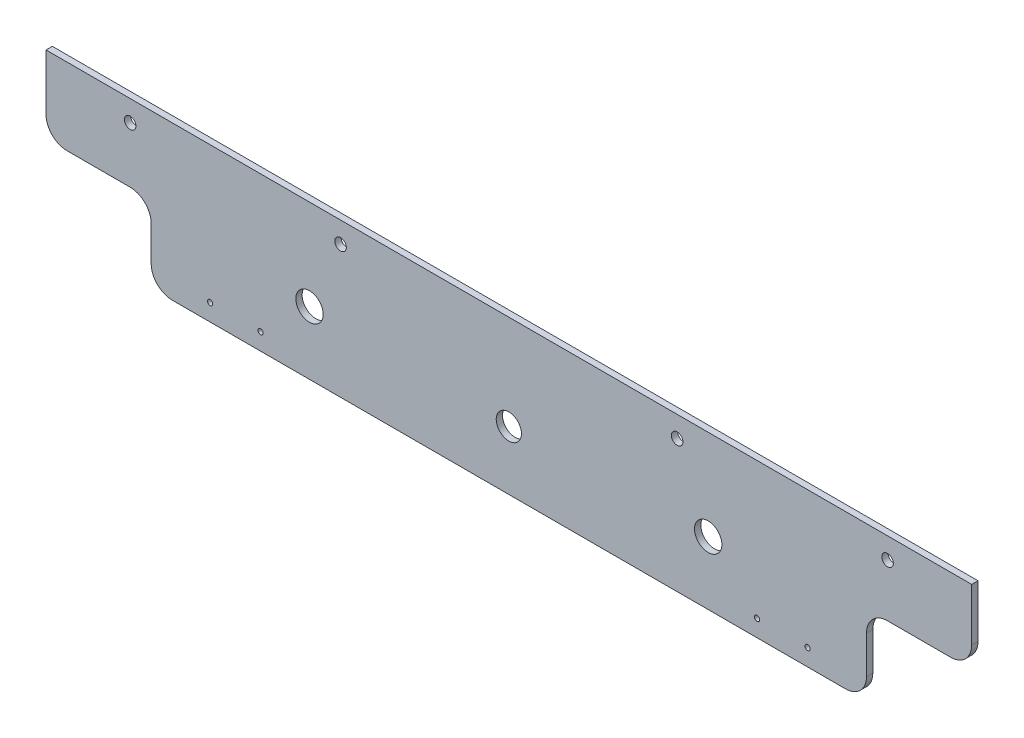
ISO-10303-21;
HEADER;
FILE_DESCRIPTION(('STEP AP214'),'2;1');
FILE_NAME('part.step','',(''),(''),'','','');
FILE_SCHEMA(('AUTOMOTIVE_DESIGN { 1 0 10303 214 1 1 1 1 }'));
ENDSEC;
DATA;
#1=APPLICATION_CONTEXT('core data for automotive mechanical design processes');
#2=APPLICATION_PROTOCOL_DEFINITION('international standard','automotive_design',2000,#1);
#3=PRODUCT_CONTEXT('',#1,'mechanical');
#4=PRODUCT('Part','Part','',(#3));
#5=PRODUCT_RELATED_PRODUCT_CATEGORY('part','',(#4));
#6=PRODUCT_DEFINITION_FORMATION('','',#4);
#7=PRODUCT_DEFINITION_CONTEXT('part definition',#1,'design');
#8=PRODUCT_DEFINITION('design','',#6,#7);
#9=PRODUCT_DEFINITION_SHAPE('','',#8);
#10=(LENGTH_UNIT() NAMED_UNIT(*) SI_UNIT(.MILLI.,.METRE.));
#11=(NAMED_UNIT(*) PLANE_ANGLE_UNIT() SI_UNIT($,.RADIAN.));
#12=(NAMED_UNIT(*) SI_UNIT($,.STERADIAN.) SOLID_ANGLE_UNIT());
#13=UNCERTAINTY_MEASURE_WITH_UNIT(LENGTH_MEASURE(1.E-05),#10,'distance_accuracy_value','');
#14=(GEOMETRIC_REPRESENTATION_CONTEXT(3) GLOBAL_UNCERTAINTY_ASSIGNED_CONTEXT((#13)) GLOBAL_UNIT_ASSIGNED_CONTEXT((#10,
#11,#12)) REPRESENTATION_CONTEXT('',''));
#15=CARTESIAN_POINT('',(0.,0.,0.));
#16=DIRECTION('',(0.,0.,1.));
#17=DIRECTION('',(1.,0.,0.));
#18=AXIS2_PLACEMENT_3D('',#15,#16,#17);
#19=CARTESIAN_POINT('',(209.999999998912,20.0000000000026,3.));
#20=DIRECTION('',(0.,0.,1.));
#21=DIRECTION('',(1.,0.,0.));
#22=AXIS2_PLACEMENT_3D('',#19,#20,#21);
#23=PLANE('',#22);
#24=CARTESIAN_POINT('',(179.999999998912,35.0000000000026,3.));
#25=DIRECTION('',(0.,0.,1.));
#26=DIRECTION('',(1.,0.,0.));
#27=AXIS2_PLACEMENT_3D('',#24,#25,#26);
#28=CIRCLE('',#27,2.75);
#29=CARTESIAN_POINT('',(182.749999998912,35.0000000000026,3.));
#30=VERTEX_POINT('',#29);
#31=EDGE_CURVE('E327',#30,#30,#28,.T.);
#32=ORIENTED_EDGE('',*,*,#31,.F.);
#33=EDGE_LOOP('',(#32));
#34=FACE_BOUND('',#33,.T.);
#35=CARTESIAN_POINT('',(79.9999999989121,35.0000000000026,3.));
#36=DIRECTION('',(0.,0.,1.));
#37=DIRECTION('',(1.,0.,0.));
#38=AXIS2_PLACEMENT_3D('',#35,#36,#37);
#39=CIRCLE('',#38,2.75);
#40=CARTESIAN_POINT('',(82.7499999989121,35.0000000000026,3.));
#41=VERTEX_POINT('',#40);
#42=EDGE_CURVE('E333',#41,#41,#39,.T.);
#43=ORIENTED_EDGE('',*,*,#42,.F.);
#44=EDGE_LOOP('',(#43));
#45=FACE_BOUND('',#44,.T.);
#46=CARTESIAN_POINT('',(-79.9999999999742,35.0000000000026,3.));
#47=DIRECTION('',(0.,0.,1.));
#48=DIRECTION('',(1.,0.,0.));
#49=AXIS2_PLACEMENT_3D('',#46,#47,#48);
#50=CIRCLE('',#49,2.75);
#51=CARTESIAN_POINT('',(-77.2499999999742,35.0000000000026,3.));
#52=VERTEX_POINT('',#51);
#53=EDGE_CURVE('E341',#52,#52,#50,.T.);
#54=ORIENTED_EDGE('',*,*,#53,.F.);
#55=EDGE_LOOP('',(#54));
#56=FACE_BOUND('',#55,.T.);
#57=CARTESIAN_POINT('',(-179.999999999974,35.0000000000026,3.));
#58=DIRECTION('',(0.,0.,1.));
#59=DIRECTION('',(1.,0.,0.));
#60=AXIS2_PLACEMENT_3D('',#57,#58,#59);
#61=CIRCLE('',#60,2.75);
#62=CARTESIAN_POINT('',(-177.249999999974,35.0000000000026,3.));
#63=VERTEX_POINT('',#62);
#64=EDGE_CURVE('E347',#63,#63,#61,.T.);
#65=ORIENTED_EDGE('',*,*,#64,.F.);
#66=EDGE_LOOP('',(#65));
#67=FACE_BOUND('',#66,.T.);
#68=CARTESIAN_POINT('',(-141.999999999439,-20.,3.));
#69=DIRECTION('',(0.,0.,1.));
#70=DIRECTION('',(1.,0.,0.));
#71=AXIS2_PLACEMENT_3D('',#68,#69,#70);
#72=CIRCLE('',#71,1.25);
#73=CARTESIAN_POINT('',(-140.749999999439,-20.,3.));
#74=VERTEX_POINT('',#73);
#75=EDGE_CURVE('E356',#74,#74,#72,.T.);
#76=ORIENTED_EDGE('',*,*,#75,.F.);
#77=EDGE_LOOP('',(#76));
#78=FACE_BOUND('',#77,.T.);
#79=CARTESIAN_POINT('',(94.7499999994415,2.00000000000815,3.));
#80=DIRECTION('',(0.,0.,1.));
#81=DIRECTION('',(1.,0.,0.));
#82=AXIS2_PLACEMENT_3D('',#79,#80,#81);
#83=CIRCLE('',#82,6.5);
#84=CARTESIAN_POINT('',(101.249999999442,2.00000000000815,3.));
#85=VERTEX_POINT('',#84);
#86=EDGE_CURVE('E368',#85,#85,#83,.T.);
#87=ORIENTED_EDGE('',*,*,#86,.F.);
#88=EDGE_LOOP('',(#87));
#89=FACE_BOUND('',#88,.T.);
#90=CARTESIAN_POINT('',(141.999999998377,-20.,3.));
#91=DIRECTION('',(0.,0.,1.));
#92=DIRECTION('',(-1.,0.,0.));
#93=AXIS2_PLACEMENT_3D('',#90,#91,#92);
#94=CIRCLE('',#93,1.25);
#95=CARTESIAN_POINT('',(140.749999998377,-20.,3.));
#96=VERTEX_POINT('',#95);
#97=EDGE_CURVE('E380',#96,#96,#94,.T.);
#98=ORIENTED_EDGE('',*,*,#97,.F.);
#99=EDGE_LOOP('',(#98));
#100=FACE_BOUND('',#99,.T.);
#101=DIRECTION('',(0.,1.,0.));
#102=VECTOR('',#101,1.);
#103=CARTESIAN_POINT('',(219.999999998912,45.0000000000026,3.));
#104=LINE('',#103,#102);
#105=CARTESIAN_POINT('',(219.999999998912,20.0000000000026,3.));
#106=VERTEX_POINT('',#105);
#107=CARTESIAN_POINT('',(219.999999998912,45.0000000000026,3.));
#108=VERTEX_POINT('',#107);
#109=EDGE_CURVE('E177',#106,#108,#104,.T.);
#110=ORIENTED_EDGE('',*,*,#109,.T.);
#111=DIRECTION('',(-1.,0.,0.));
#112=VECTOR('',#111,1.);
#113=CARTESIAN_POINT('',(219.999999998912,45.0000000000026,3.));
#114=LINE('',#113,#112);
#115=CARTESIAN_POINT('',(-219.999999999974,45.0000000000025,3.));
#116=VERTEX_POINT('',#115);
#117=EDGE_CURVE('E95',#108,#116,#114,.T.);
#118=ORIENTED_EDGE('',*,*,#117,.T.);
#119=DIRECTION('',(0.,-1.,0.));
#120=VECTOR('',#119,1.);
#121=CARTESIAN_POINT('',(-219.999999999974,45.0000000000025,3.));
#122=LINE('',#121,#120);
#123=CARTESIAN_POINT('',(-219.999999999975,18.5000000000025,3.));
#124=VERTEX_POINT('',#123);
#125=EDGE_CURVE('E210',#116,#124,#122,.T.);
#126=ORIENTED_EDGE('',*,*,#125,.T.);
#127=CARTESIAN_POINT('',(-209.999999999974,18.5000000000025,3.));
#128=DIRECTION('',(0.,0.,1.));
#129=DIRECTION('',(-1.,0.,0.));
#130=AXIS2_PLACEMENT_3D('',#127,#128,#129);
#131=CIRCLE('',#130,10.);
#132=CARTESIAN_POINT('',(-209.999999999974,8.50000000000245,3.));
#133=VERTEX_POINT('',#132);
#134=EDGE_CURVE('E229',#124,#133,#131,.T.);
#135=ORIENTED_EDGE('',*,*,#134,.T.);
#136=DIRECTION('',(1.,0.,0.));
#137=VECTOR('',#136,1.);
#138=CARTESIAN_POINT('',(-209.999999999974,8.50000000000246,3.));
#139=LINE('',#138,#137);
#140=CARTESIAN_POINT('',(-179.999999999974,8.50000000000248,3.));
#141=VERTEX_POINT('',#140);
#142=EDGE_CURVE('E226',#133,#141,#139,.T.);
#143=ORIENTED_EDGE('',*,*,#142,.T.);
#144=CARTESIAN_POINT('',(-179.999999999974,-1.49999999999757,3.));
#145=DIRECTION('',(0.,0.,-1.));
#146=DIRECTION('',(-1.,0.,0.));
#147=AXIS2_PLACEMENT_3D('',#144,#145,#146);
#148=CIRCLE('',#147,10.);
#149=CARTESIAN_POINT('',(-169.999999999974,-1.49999999999756,3.));
#150=VERTEX_POINT('',#149);
#151=EDGE_CURVE('E228',#141,#150,#148,.T.);
#152=ORIENTED_EDGE('',*,*,#151,.T.);
#153=DIRECTION('',(0.,-1.,0.));
#154=VECTOR('',#153,1.);
#155=CARTESIAN_POINT('',(-169.999999999974,-1.49999999999756,3.));
#156=LINE('',#155,#154);
#157=CARTESIAN_POINT('',(-169.999999999974,-17.9999999999975,3.));
#158=VERTEX_POINT('',#157);
#159=EDGE_CURVE('E231',#150,#158,#156,.T.);
#160=ORIENTED_EDGE('',*,*,#159,.T.);
#161=CARTESIAN_POINT('',(-159.999999999974,-17.9999999999975,3.));
#162=DIRECTION('',(0.,0.,1.));
#163=DIRECTION('',(1.,0.,0.));
#164=AXIS2_PLACEMENT_3D('',#161,#162,#163);
#165=CIRCLE('',#164,10.);
#166=CARTESIAN_POINT('',(-159.999999999974,-27.9999999999975,3.));
#167=VERTEX_POINT('',#166);
#168=EDGE_CURVE('E237',#158,#167,#165,.T.);
#169=ORIENTED_EDGE('',*,*,#168,.T.);
#170=DIRECTION('',(1.,0.,0.));
#171=VECTOR('',#170,1.);
#172=CARTESIAN_POINT('',(159.999999998912,-27.9999999999974,3.));
#173=LINE('',#172,#171);
#174=CARTESIAN_POINT('',(159.999999998912,-27.9999999999974,3.));
#175=VERTEX_POINT('',#174);
#176=EDGE_CURVE('E239',#167,#175,#173,.T.);
#177=ORIENTED_EDGE('',*,*,#176,.T.);
#178=CARTESIAN_POINT('',(159.999999998912,-17.9999999999973,3.));
#179=DIRECTION('',(0.,0.,1.));
#180=DIRECTION('',(-1.,0.,0.));
#181=AXIS2_PLACEMENT_3D('',#178,#179,#180);
#182=CIRCLE('',#181,10.);
#183=CARTESIAN_POINT('',(169.999999998912,-17.9999999999973,3.));
#184=VERTEX_POINT('',#183);
#185=EDGE_CURVE('E241',#175,#184,#182,.T.);
#186=ORIENTED_EDGE('',*,*,#185,.T.);
#187=DIRECTION('',(0.,1.,0.));
#188=VECTOR('',#187,1.);
#189=CARTESIAN_POINT('',(169.999999998912,2.55481399924485E-12,3.));
#190=LINE('',#189,#188);
#191=CARTESIAN_POINT('',(169.999999998912,2.55481399924485E-12,3.));
#192=VERTEX_POINT('',#191);
#193=EDGE_CURVE('E132',#184,#192,#190,.T.);
#194=ORIENTED_EDGE('',*,*,#193,.T.);
#195=CARTESIAN_POINT('',(179.999999998912,2.55611504185183E-12,3.));
#196=DIRECTION('',(0.,0.,-1.));
#197=DIRECTION('',(-1.,0.,0.));
#198=AXIS2_PLACEMENT_3D('',#195,#196,#197);
#199=CIRCLE('',#198,10.);
#200=CARTESIAN_POINT('',(179.999999998912,10.0000000000026,3.));
#201=VERTEX_POINT('',#200);
#202=EDGE_CURVE('E126',#192,#201,#199,.T.);
#203=ORIENTED_EDGE('',*,*,#202,.T.);
#204=DIRECTION('',(1.,0.,0.));
#205=VECTOR('',#204,1.);
#206=CARTESIAN_POINT('',(209.999999998912,10.0000000000026,3.));
#207=LINE('',#206,#205);
#208=CARTESIAN_POINT('',(209.999999998912,10.0000000000026,3.));
#209=VERTEX_POINT('',#208);
#210=EDGE_CURVE('E130',#201,#209,#207,.T.);
#211=ORIENTED_EDGE('',*,*,#210,.T.);
#212=CARTESIAN_POINT('',(209.999999998912,20.0000000000026,3.));
#213=DIRECTION('',(0.,0.,1.));
#214=DIRECTION('',(1.,0.,0.));
#215=AXIS2_PLACEMENT_3D('',#212,#213,#214);
#216=CIRCLE('',#215,10.);
#217=EDGE_CURVE('E34',#209,#106,#216,.T.);
#218=ORIENTED_EDGE('',*,*,#217,.T.);
#219=EDGE_LOOP('',(#110,#118,#126,#135,#143,#152,#160,#169,#177,#186,#194,#203,#211,#218));
#220=FACE_BOUND('',#219,.T.);
#221=CARTESIAN_POINT('',(117.999999998377,-20.0000000000002,3.));
#222=DIRECTION('',(0.,0.,1.));
#223=DIRECTION('',(-1.,0.,0.));
#224=AXIS2_PLACEMENT_3D('',#221,#222,#223);
#225=CIRCLE('',#224,1.25);
#226=CARTESIAN_POINT('',(116.749999998377,-20.0000000000002,3.));
#227=VERTEX_POINT('',#226);
#228=EDGE_CURVE('E154',#227,#227,#225,.T.);
#229=ORIENTED_EDGE('',*,*,#228,.F.);
#230=EDGE_LOOP('',(#229));
#231=FACE_BOUND('',#230,.T.);
#232=CARTESIAN_POINT('',(-94.7500000005567,2.00000000000073,3.));
#233=DIRECTION('',(0.,0.,1.));
#234=DIRECTION('',(1.,0.,0.));
#235=AXIS2_PLACEMENT_3D('',#232,#233,#234);
#236=CIRCLE('',#235,6.5);
#237=CARTESIAN_POINT('',(-88.2500000005567,2.00000000000073,3.));
#238=VERTEX_POINT('',#237);
#239=EDGE_CURVE('E374',#238,#238,#236,.T.);
#240=ORIENTED_EDGE('',*,*,#239,.F.);
#241=EDGE_LOOP('',(#240));
#242=FACE_BOUND('',#241,.T.);
#243=CARTESIAN_POINT('',(0.,0.,3.));
#244=DIRECTION('',(0.,0.,1.));
#245=DIRECTION('',(1.,0.,0.));
#246=AXIS2_PLACEMENT_3D('',#243,#244,#245);
#247=CIRCLE('',#246,6.);
#248=CARTESIAN_POINT('',(6.,0.,3.));
#249=VERTEX_POINT('',#248);
#250=EDGE_CURVE('E362',#249,#249,#247,.T.);
#251=ORIENTED_EDGE('',*,*,#250,.F.);
#252=EDGE_LOOP('',(#251));
#253=FACE_BOUND('',#252,.T.);
#254=CARTESIAN_POINT('',(-117.999999999439,-20.0000000000002,3.));
#255=DIRECTION('',(0.,0.,1.));
#256=DIRECTION('',(1.,0.,0.));
#257=AXIS2_PLACEMENT_3D('',#254,#255,#256);
#258=CIRCLE('',#257,1.25);
#259=CARTESIAN_POINT('',(-116.749999999439,-20.0000000000002,3.));
#260=VERTEX_POINT('',#259);
#261=EDGE_CURVE('E350',#260,#260,#258,.T.);
#262=ORIENTED_EDGE('',*,*,#261,.F.);
#263=EDGE_LOOP('',(#262));
#264=FACE_BOUND('',#263,.T.);
#265=ADVANCED_FACE('F17',(#34,#45,#56,#67,#78,#89,#100,#220,#231,#242,#253,#264),#23,.T.);
#266=CARTESIAN_POINT('',(209.999999998912,20.0000000000026,0.));
#267=DIRECTION('',(0.,0.,1.));
#268=DIRECTION('',(1.,0.,0.));
#269=AXIS2_PLACEMENT_3D('',#266,#267,#268);
#270=PLANE('',#269);
#271=CARTESIAN_POINT('',(179.999999998912,35.0000000000026,0.));
#272=DIRECTION('',(0.,0.,1.));
#273=DIRECTION('',(1.,0.,0.));
#274=AXIS2_PLACEMENT_3D('',#271,#272,#273);
#275=CIRCLE('',#274,2.75);
#276=CARTESIAN_POINT('',(182.749999998912,35.0000000000026,0.));
#277=VERTEX_POINT('',#276);
#278=EDGE_CURVE('E325',#277,#277,#275,.T.);
#279=ORIENTED_EDGE('',*,*,#278,.T.);
#280=EDGE_LOOP('',(#279));
#281=FACE_BOUND('',#280,.T.);
#282=CARTESIAN_POINT('',(79.9999999989121,35.0000000000026,0.));
#283=DIRECTION('',(0.,0.,1.));
#284=DIRECTION('',(1.,0.,0.));
#285=AXIS2_PLACEMENT_3D('',#282,#283,#284);
#286=CIRCLE('',#285,2.75);
#287=CARTESIAN_POINT('',(82.7499999989121,35.0000000000026,0.));
#288=VERTEX_POINT('',#287);
#289=EDGE_CURVE('E328',#288,#288,#286,.T.);
#290=ORIENTED_EDGE('',*,*,#289,.T.);
#291=EDGE_LOOP('',(#290));
#292=FACE_BOUND('',#291,.T.);
#293=CARTESIAN_POINT('',(-79.9999999999742,35.0000000000026,0.));
#294=DIRECTION('',(0.,0.,1.));
#295=DIRECTION('',(1.,0.,0.));
#296=AXIS2_PLACEMENT_3D('',#293,#294,#295);
#297=CIRCLE('',#296,2.75);
#298=CARTESIAN_POINT('',(-77.2499999999742,35.0000000000026,0.));
#299=VERTEX_POINT('',#298);
#300=EDGE_CURVE('E338',#299,#299,#297,.T.);
#301=ORIENTED_EDGE('',*,*,#300,.T.);
#302=EDGE_LOOP('',(#301));
#303=FACE_BOUND('',#302,.T.);
#304=CARTESIAN_POINT('',(-179.999999999974,35.0000000000026,0.));
#305=DIRECTION('',(0.,0.,1.));
#306=DIRECTION('',(1.,0.,0.));
#307=AXIS2_PLACEMENT_3D('',#304,#305,#306);
#308=CIRCLE('',#307,2.75);
#309=CARTESIAN_POINT('',(-177.249999999974,35.0000000000026,0.));
#310=VERTEX_POINT('',#309);
#311=EDGE_CURVE('E344',#310,#310,#308,.T.);
#312=ORIENTED_EDGE('',*,*,#311,.T.);
#313=EDGE_LOOP('',(#312));
#314=FACE_BOUND('',#313,.T.);
#315=DIRECTION('',(0.,1.,0.));
#316=VECTOR('',#315,1.);
#317=CARTESIAN_POINT('',(219.999999998912,45.0000000000026,0.));
#318=LINE('',#317,#316);
#319=CARTESIAN_POINT('',(219.999999998912,20.0000000000026,0.));
#320=VERTEX_POINT('',#319);
#321=CARTESIAN_POINT('',(219.999999998912,45.0000000000026,0.));
#322=VERTEX_POINT('',#321);
#323=EDGE_CURVE('E150',#320,#322,#318,.T.);
#324=ORIENTED_EDGE('',*,*,#323,.F.);
#325=CARTESIAN_POINT('',(209.999999998912,20.0000000000026,0.));
#326=DIRECTION('',(0.,0.,1.));
#327=DIRECTION('',(1.,0.,0.));
#328=AXIS2_PLACEMENT_3D('',#325,#326,#327);
#329=CIRCLE('',#328,10.);
#330=CARTESIAN_POINT('',(209.999999998912,10.0000000000026,0.));
#331=VERTEX_POINT('',#330);
#332=EDGE_CURVE('E87',#331,#320,#329,.T.);
#333=ORIENTED_EDGE('',*,*,#332,.F.);
#334=DIRECTION('',(1.,0.,0.));
#335=VECTOR('',#334,1.);
#336=CARTESIAN_POINT('',(209.999999998912,10.0000000000026,0.));
#337=LINE('',#336,#335);
#338=CARTESIAN_POINT('',(179.999999998912,10.0000000000026,0.));
#339=VERTEX_POINT('',#338);
#340=EDGE_CURVE('E81',#339,#331,#337,.T.);
#341=ORIENTED_EDGE('',*,*,#340,.F.);
#342=CARTESIAN_POINT('',(179.999999998912,2.55611504185183E-12,0.));
#343=DIRECTION('',(0.,0.,-1.));
#344=DIRECTION('',(-1.,0.,0.));
#345=AXIS2_PLACEMENT_3D('',#342,#343,#344);
#346=CIRCLE('',#345,10.);
#347=CARTESIAN_POINT('',(169.999999998912,2.55481399924485E-12,0.));
#348=VERTEX_POINT('',#347);
#349=EDGE_CURVE('E140',#348,#339,#346,.T.);
#350=ORIENTED_EDGE('',*,*,#349,.F.);
#351=DIRECTION('',(0.,1.,0.));
#352=VECTOR('',#351,1.);
#353=CARTESIAN_POINT('',(169.999999998912,2.55481399924485E-12,0.));
#354=LINE('',#353,#352);
#355=CARTESIAN_POINT('',(169.999999998912,-17.9999999999973,0.));
#356=VERTEX_POINT('',#355);
#357=EDGE_CURVE('E172',#356,#348,#354,.T.);
#358=ORIENTED_EDGE('',*,*,#357,.F.);
#359=CARTESIAN_POINT('',(159.999999998912,-17.9999999999973,0.));
#360=DIRECTION('',(0.,0.,1.));
#361=DIRECTION('',(-1.,0.,0.));
#362=AXIS2_PLACEMENT_3D('',#359,#360,#361);
#363=CIRCLE('',#362,10.);
#364=CARTESIAN_POINT('',(159.999999998912,-27.9999999999974,0.));
#365=VERTEX_POINT('',#364);
#366=EDGE_CURVE('E170',#365,#356,#363,.T.);
#367=ORIENTED_EDGE('',*,*,#366,.F.);
#368=DIRECTION('',(1.,0.,0.));
#369=VECTOR('',#368,1.);
#370=CARTESIAN_POINT('',(159.999999998912,-27.9999999999974,0.));
#371=LINE('',#370,#369);
#372=CARTESIAN_POINT('',(-159.999999999974,-27.9999999999975,0.));
#373=VERTEX_POINT('',#372);
#374=EDGE_CURVE('E168',#373,#365,#371,.T.);
#375=ORIENTED_EDGE('',*,*,#374,.F.);
#376=CARTESIAN_POINT('',(-159.999999999974,-17.9999999999975,0.));
#377=DIRECTION('',(0.,0.,1.));
#378=DIRECTION('',(1.,0.,0.));
#379=AXIS2_PLACEMENT_3D('',#376,#377,#378);
#380=CIRCLE('',#379,10.);
#381=CARTESIAN_POINT('',(-169.999999999974,-17.9999999999975,0.));
#382=VERTEX_POINT('',#381);
#383=EDGE_CURVE('E166',#382,#373,#380,.T.);
#384=ORIENTED_EDGE('',*,*,#383,.F.);
#385=DIRECTION('',(0.,-1.,0.));
#386=VECTOR('',#385,1.);
#387=CARTESIAN_POINT('',(-169.999999999974,-1.49999999999756,0.));
#388=LINE('',#387,#386);
#389=CARTESIAN_POINT('',(-169.999999999974,-1.49999999999756,0.));
#390=VERTEX_POINT('',#389);
#391=EDGE_CURVE('E164',#390,#382,#388,.T.);
#392=ORIENTED_EDGE('',*,*,#391,.F.);
#393=CARTESIAN_POINT('',(-179.999999999974,-1.49999999999757,0.));
#394=DIRECTION('',(0.,0.,-1.));
#395=DIRECTION('',(-1.,0.,0.));
#396=AXIS2_PLACEMENT_3D('',#393,#394,#395);
#397=CIRCLE('',#396,10.);
#398=CARTESIAN_POINT('',(-179.999999999974,8.50000000000248,0.));
#399=VERTEX_POINT('',#398);
#400=EDGE_CURVE('E162',#399,#390,#397,.T.);
#401=ORIENTED_EDGE('',*,*,#400,.F.);
#402=DIRECTION('',(1.,0.,0.));
#403=VECTOR('',#402,1.);
#404=CARTESIAN_POINT('',(-209.999999999974,8.50000000000246,0.));
#405=LINE('',#404,#403);
#406=CARTESIAN_POINT('',(-209.999999999974,8.50000000000245,0.));
#407=VERTEX_POINT('',#406);
#408=EDGE_CURVE('E160',#407,#399,#405,.T.);
#409=ORIENTED_EDGE('',*,*,#408,.F.);
#410=CARTESIAN_POINT('',(-209.999999999974,18.5000000000025,0.));
#411=DIRECTION('',(0.,0.,1.));
#412=DIRECTION('',(-1.,0.,0.));
#413=AXIS2_PLACEMENT_3D('',#410,#411,#412);
#414=CIRCLE('',#413,10.);
#415=CARTESIAN_POINT('',(-219.999999999975,18.5000000000025,0.));
#416=VERTEX_POINT('',#415);
#417=EDGE_CURVE('E158',#416,#407,#414,.T.);
#418=ORIENTED_EDGE('',*,*,#417,.F.);
#419=DIRECTION('',(0.,-1.,0.));
#420=VECTOR('',#419,1.);
#421=CARTESIAN_POINT('',(-219.999999999974,45.0000000000025,0.));
#422=LINE('',#421,#420);
#423=CARTESIAN_POINT('',(-219.999999999974,45.0000000000025,0.));
#424=VERTEX_POINT('',#423);
#425=EDGE_CURVE('E156',#424,#416,#422,.T.);
#426=ORIENTED_EDGE('',*,*,#425,.F.);
#427=DIRECTION('',(-1.,0.,0.));
#428=VECTOR('',#427,1.);
#429=CARTESIAN_POINT('',(219.999999998912,45.0000000000026,0.));
#430=LINE('',#429,#428);
#431=EDGE_CURVE('E153',#322,#424,#430,.T.);
#432=ORIENTED_EDGE('',*,*,#431,.F.);
#433=EDGE_LOOP('',(#324,#333,#341,#350,#358,#367,#375,#384,#392,#401,#409,#418,#426,#432));
#434=FACE_BOUND('',#433,.T.);
#435=CARTESIAN_POINT('',(117.999999998377,-20.0000000000002,0.));
#436=DIRECTION('',(0.,0.,1.));
#437=DIRECTION('',(-1.,0.,0.));
#438=AXIS2_PLACEMENT_3D('',#435,#436,#437);
#439=CIRCLE('',#438,1.25);
#440=CARTESIAN_POINT('',(116.749999998377,-20.0000000000002,0.));
#441=VERTEX_POINT('',#440);
#442=EDGE_CURVE('E383',#441,#441,#439,.T.);
#443=ORIENTED_EDGE('',*,*,#442,.T.);
#444=EDGE_LOOP('',(#443));
#445=FACE_BOUND('',#444,.T.);
#446=CARTESIAN_POINT('',(141.999999998377,-20.,0.));
#447=DIRECTION('',(0.,0.,1.));
#448=DIRECTION('',(-1.,0.,0.));
#449=AXIS2_PLACEMENT_3D('',#446,#447,#448);
#450=CIRCLE('',#449,1.25);
#451=CARTESIAN_POINT('',(140.749999998377,-20.,0.));
#452=VERTEX_POINT('',#451);
#453=EDGE_CURVE('E377',#452,#452,#450,.T.);
#454=ORIENTED_EDGE('',*,*,#453,.T.);
#455=EDGE_LOOP('',(#454));
#456=FACE_BOUND('',#455,.T.);
#457=CARTESIAN_POINT('',(-94.7500000005567,2.00000000000073,0.));
#458=DIRECTION('',(0.,0.,1.));
#459=DIRECTION('',(1.,0.,0.));
#460=AXIS2_PLACEMENT_3D('',#457,#458,#459);
#461=CIRCLE('',#460,6.5);
#462=CARTESIAN_POINT('',(-88.2500000005567,2.00000000000073,0.));
#463=VERTEX_POINT('',#462);
#464=EDGE_CURVE('E371',#463,#463,#461,.T.);
#465=ORIENTED_EDGE('',*,*,#464,.T.);
#466=EDGE_LOOP('',(#465));
#467=FACE_BOUND('',#466,.T.);
#468=CARTESIAN_POINT('',(94.7499999994415,2.00000000000815,0.));
#469=DIRECTION('',(0.,0.,1.));
#470=DIRECTION('',(1.,0.,0.));
#471=AXIS2_PLACEMENT_3D('',#468,#469,#470);
#472=CIRCLE('',#471,6.5);
#473=CARTESIAN_POINT('',(101.249999999442,2.00000000000815,0.));
#474=VERTEX_POINT('',#473);
#475=EDGE_CURVE('E365',#474,#474,#472,.T.);
#476=ORIENTED_EDGE('',*,*,#475,.T.);
#477=EDGE_LOOP('',(#476));
#478=FACE_BOUND('',#477,.T.);
#479=CARTESIAN_POINT('',(0.,0.,0.));
#480=DIRECTION('',(0.,0.,1.));
#481=DIRECTION('',(1.,0.,0.));
#482=AXIS2_PLACEMENT_3D('',#479,#480,#481);
#483=CIRCLE('',#482,6.);
#484=CARTESIAN_POINT('',(6.,0.,0.));
#485=VERTEX_POINT('',#484);
#486=EDGE_CURVE('E359',#485,#485,#483,.T.);
#487=ORIENTED_EDGE('',*,*,#486,.T.);
#488=EDGE_LOOP('',(#487));
#489=FACE_BOUND('',#488,.T.);
#490=CARTESIAN_POINT('',(-141.999999999439,-20.,0.));
#491=DIRECTION('',(0.,0.,1.));
#492=DIRECTION('',(1.,0.,0.));
#493=AXIS2_PLACEMENT_3D('',#490,#491,#492);
#494=CIRCLE('',#493,1.25);
#495=CARTESIAN_POINT('',(-140.749999999439,-20.,0.));
#496=VERTEX_POINT('',#495);
#497=EDGE_CURVE('E353',#496,#496,#494,.T.);
#498=ORIENTED_EDGE('',*,*,#497,.T.);
#499=EDGE_LOOP('',(#498));
#500=FACE_BOUND('',#499,.T.);
#501=CARTESIAN_POINT('',(-117.999999999439,-20.0000000000002,0.));
#502=DIRECTION('',(0.,0.,1.));
#503=DIRECTION('',(1.,0.,0.));
#504=AXIS2_PLACEMENT_3D('',#501,#502,#503);
#505=CIRCLE('',#504,1.25);
#506=CARTESIAN_POINT('',(-116.749999999439,-20.0000000000002,0.));
#507=VERTEX_POINT('',#506);
#508=EDGE_CURVE('E330',#507,#507,#505,.T.);
#509=ORIENTED_EDGE('',*,*,#508,.T.);
#510=EDGE_LOOP('',(#509));
#511=FACE_BOUND('',#510,.T.);
#512=ADVANCED_FACE('F214',(#281,#292,#303,#314,#434,#445,#456,#467,#478,#489,#500,#511),#270,.F.);
#513=CARTESIAN_POINT('',(219.999999998912,45.0000000000026,3.));
#514=DIRECTION('',(-1.,0.,0.));
#515=DIRECTION('',(0.,0.,1.));
#516=AXIS2_PLACEMENT_3D('',#513,#514,#515);
#517=PLANE('',#516);
#518=ORIENTED_EDGE('',*,*,#323,.T.);
#519=DIRECTION('',(0.,0.,-1.));
#520=VECTOR('',#519,1.);
#521=CARTESIAN_POINT('',(219.999999998912,45.0000000000026,3.));
#522=LINE('',#521,#520);
#523=EDGE_CURVE('E11',#108,#322,#522,.T.);
#524=ORIENTED_EDGE('',*,*,#523,.F.);
#525=ORIENTED_EDGE('',*,*,#109,.F.);
#526=DIRECTION('',(0.,0.,-1.));
#527=VECTOR('',#526,1.);
#528=CARTESIAN_POINT('',(219.999999998912,20.0000000000026,3.));
#529=LINE('',#528,#527);
#530=EDGE_CURVE('E146',#106,#320,#529,.T.);
#531=ORIENTED_EDGE('',*,*,#530,.T.);
#532=EDGE_LOOP('',(#518,#524,#525,#531));
#533=FACE_BOUND('',#532,.T.);
#534=ADVANCED_FACE('F19',(#533),#517,.F.);
#535=CARTESIAN_POINT('',(219.999999998912,45.0000000000026,3.));
#536=DIRECTION('',(0.,-1.,0.));
#537=DIRECTION('',(1.,0.,0.));
#538=AXIS2_PLACEMENT_3D('',#535,#536,#537);
#539=PLANE('',#538);
#540=ORIENTED_EDGE('',*,*,#431,.T.);
#541=DIRECTION('',(0.,0.,-1.));
#542=VECTOR('',#541,1.);
#543=CARTESIAN_POINT('',(-219.999999999974,45.0000000000025,3.));
#544=LINE('',#543,#542);
#545=EDGE_CURVE('E26',#116,#424,#544,.T.);
#546=ORIENTED_EDGE('',*,*,#545,.F.);
#547=ORIENTED_EDGE('',*,*,#117,.F.);
#548=ORIENTED_EDGE('',*,*,#523,.T.);
#549=EDGE_LOOP('',(#540,#546,#547,#548));
#550=FACE_BOUND('',#549,.T.);
#551=ADVANCED_FACE('F523',(#550),#539,.F.);
#552=CARTESIAN_POINT('',(-219.999999999974,45.0000000000025,3.));
#553=DIRECTION('',(1.,0.,0.));
#554=DIRECTION('',(0.,1.,0.));
#555=AXIS2_PLACEMENT_3D('',#552,#553,#554);
#556=PLANE('',#555);
#557=ORIENTED_EDGE('',*,*,#425,.T.);
#558=DIRECTION('',(0.,0.,-1.));
#559=VECTOR('',#558,1.);
#560=CARTESIAN_POINT('',(-219.999999999975,18.5000000000025,3.));
#561=LINE('',#560,#559);
#562=EDGE_CURVE('E202',#124,#416,#561,.T.);
#563=ORIENTED_EDGE('',*,*,#562,.F.);
#564=ORIENTED_EDGE('',*,*,#125,.F.);
#565=ORIENTED_EDGE('',*,*,#545,.T.);
#566=EDGE_LOOP('',(#557,#563,#564,#565));
#567=FACE_BOUND('',#566,.T.);
#568=ADVANCED_FACE('F208',(#567),#556,.F.);
#569=CARTESIAN_POINT('',(-209.999999999974,18.5000000000025,3.));
#570=DIRECTION('',(0.,0.,-1.));
#571=DIRECTION('',(-1.,0.,0.));
#572=AXIS2_PLACEMENT_3D('',#569,#570,#571);
#573=CYLINDRICAL_SURFACE('',#572,10.);
#574=ORIENTED_EDGE('',*,*,#417,.T.);
#575=DIRECTION('',(0.,0.,-1.));
#576=VECTOR('',#575,1.);
#577=CARTESIAN_POINT('',(-209.999999999974,8.50000000000245,3.));
#578=LINE('',#577,#576);
#579=EDGE_CURVE('E199',#133,#407,#578,.T.);
#580=ORIENTED_EDGE('',*,*,#579,.F.);
#581=ORIENTED_EDGE('',*,*,#134,.F.);
#582=ORIENTED_EDGE('',*,*,#562,.T.);
#583=EDGE_LOOP('',(#574,#580,#581,#582));
#584=FACE_BOUND('',#583,.T.);
#585=ADVANCED_FACE('F220',(#584),#573,.T.);
#586=CARTESIAN_POINT('',(-209.999999999974,8.50000000000246,3.));
#587=DIRECTION('',(0.,1.,0.));
#588=DIRECTION('',(-1.,0.,0.));
#589=AXIS2_PLACEMENT_3D('',#586,#587,#588);
#590=PLANE('',#589);
#591=ORIENTED_EDGE('',*,*,#408,.T.);
#592=DIRECTION('',(0.,0.,-1.));
#593=VECTOR('',#592,1.);
#594=CARTESIAN_POINT('',(-179.999999999974,8.50000000000248,3.));
#595=LINE('',#594,#593);
#596=EDGE_CURVE('E196',#141,#399,#595,.T.);
#597=ORIENTED_EDGE('',*,*,#596,.F.);
#598=ORIENTED_EDGE('',*,*,#142,.F.);
#599=ORIENTED_EDGE('',*,*,#579,.T.);
#600=EDGE_LOOP('',(#591,#597,#598,#599));
#601=FACE_BOUND('',#600,.T.);
#602=ADVANCED_FACE('F224',(#601),#590,.F.);
#603=CARTESIAN_POINT('',(-179.999999999974,-1.49999999999757,3.));
#604=DIRECTION('',(0.,0.,-1.));
#605=DIRECTION('',(-1.,0.,0.));
#606=AXIS2_PLACEMENT_3D('',#603,#604,#605);
#607=CYLINDRICAL_SURFACE('',#606,10.);
#608=ORIENTED_EDGE('',*,*,#400,.T.);
#609=DIRECTION('',(0.,0.,-1.));
#610=VECTOR('',#609,1.);
#611=CARTESIAN_POINT('',(-169.999999999974,-1.49999999999756,3.));
#612=LINE('',#611,#610);
#613=EDGE_CURVE('E193',#150,#390,#612,.T.);
#614=ORIENTED_EDGE('',*,*,#613,.F.);
#615=ORIENTED_EDGE('',*,*,#151,.F.);
#616=ORIENTED_EDGE('',*,*,#596,.T.);
#617=EDGE_LOOP('',(#608,#614,#615,#616));
#618=FACE_BOUND('',#617,.T.);
#619=ADVANCED_FACE('F549',(#618),#607,.F.);
#620=CARTESIAN_POINT('',(-169.999999999974,-1.49999999999756,3.));
#621=DIRECTION('',(1.,0.,0.));
#622=DIRECTION('',(0.,1.,0.));
#623=AXIS2_PLACEMENT_3D('',#620,#621,#622);
#624=PLANE('',#623);
#625=ORIENTED_EDGE('',*,*,#391,.T.);
#626=DIRECTION('',(0.,0.,-1.));
#627=VECTOR('',#626,1.);
#628=CARTESIAN_POINT('',(-169.999999999974,-17.9999999999975,3.));
#629=LINE('',#628,#627);
#630=EDGE_CURVE('E190',#158,#382,#629,.T.);
#631=ORIENTED_EDGE('',*,*,#630,.F.);
#632=ORIENTED_EDGE('',*,*,#159,.F.);
#633=ORIENTED_EDGE('',*,*,#613,.T.);
#634=EDGE_LOOP('',(#625,#631,#632,#633));
#635=FACE_BOUND('',#634,.T.);
#636=ADVANCED_FACE('F557',(#635),#624,.F.);
#637=CARTESIAN_POINT('',(-159.999999999974,-17.9999999999975,3.));
#638=DIRECTION('',(0.,0.,-1.));
#639=DIRECTION('',(-1.,0.,0.));
#640=AXIS2_PLACEMENT_3D('',#637,#638,#639);
#641=CYLINDRICAL_SURFACE('',#640,10.);
#642=ORIENTED_EDGE('',*,*,#383,.T.);
#643=DIRECTION('',(0.,0.,-1.));
#644=VECTOR('',#643,1.);
#645=CARTESIAN_POINT('',(-159.999999999974,-27.9999999999975,3.));
#646=LINE('',#645,#644);
#647=EDGE_CURVE('E187',#167,#373,#646,.T.);
#648=ORIENTED_EDGE('',*,*,#647,.F.);
#649=ORIENTED_EDGE('',*,*,#168,.F.);
#650=ORIENTED_EDGE('',*,*,#630,.T.);
#651=EDGE_LOOP('',(#642,#648,#649,#650));
#652=FACE_BOUND('',#651,.T.);
#653=ADVANCED_FACE('F566',(#652),#641,.T.);
#654=CARTESIAN_POINT('',(159.999999998912,-27.9999999999974,3.));
#655=DIRECTION('',(0.,1.,0.));
#656=DIRECTION('',(-1.,0.,0.));
#657=AXIS2_PLACEMENT_3D('',#654,#655,#656);
#658=PLANE('',#657);
#659=ORIENTED_EDGE('',*,*,#374,.T.);
#660=DIRECTION('',(0.,0.,-1.));
#661=VECTOR('',#660,1.);
#662=CARTESIAN_POINT('',(159.999999998912,-27.9999999999974,3.));
#663=LINE('',#662,#661);
#664=EDGE_CURVE('E184',#175,#365,#663,.T.);
#665=ORIENTED_EDGE('',*,*,#664,.F.);
#666=ORIENTED_EDGE('',*,*,#176,.F.);
#667=ORIENTED_EDGE('',*,*,#647,.T.);
#668=EDGE_LOOP('',(#659,#665,#666,#667));
#669=FACE_BOUND('',#668,.T.);
#670=ADVANCED_FACE('F575',(#669),#658,.F.);
#671=CARTESIAN_POINT('',(159.999999998912,-17.9999999999973,3.));
#672=DIRECTION('',(0.,0.,-1.));
#673=DIRECTION('',(-1.,0.,0.));
#674=AXIS2_PLACEMENT_3D('',#671,#672,#673);
#675=CYLINDRICAL_SURFACE('',#674,10.);
#676=ORIENTED_EDGE('',*,*,#366,.T.);
#677=DIRECTION('',(0.,0.,-1.));
#678=VECTOR('',#677,1.);
#679=CARTESIAN_POINT('',(169.999999998912,-17.9999999999973,3.));
#680=LINE('',#679,#678);
#681=EDGE_CURVE('E181',#184,#356,#680,.T.);
#682=ORIENTED_EDGE('',*,*,#681,.F.);
#683=ORIENTED_EDGE('',*,*,#185,.F.);
#684=ORIENTED_EDGE('',*,*,#664,.T.);
#685=EDGE_LOOP('',(#676,#682,#683,#684));
#686=FACE_BOUND('',#685,.T.);
#687=ADVANCED_FACE('F247',(#686),#675,.T.);
#688=CARTESIAN_POINT('',(169.999999998912,2.55481399924485E-12,3.));
#689=DIRECTION('',(-1.,0.,0.));
#690=DIRECTION('',(0.,-1.,0.));
#691=AXIS2_PLACEMENT_3D('',#688,#689,#690);
#692=PLANE('',#691);
#693=ORIENTED_EDGE('',*,*,#357,.T.);
#694=DIRECTION('',(0.,0.,-1.));
#695=VECTOR('',#694,1.);
#696=CARTESIAN_POINT('',(169.999999998912,2.55481399924485E-12,3.));
#697=LINE('',#696,#695);
#698=EDGE_CURVE('E141',#192,#348,#697,.T.);
#699=ORIENTED_EDGE('',*,*,#698,.F.);
#700=ORIENTED_EDGE('',*,*,#193,.F.);
#701=ORIENTED_EDGE('',*,*,#681,.T.);
#702=EDGE_LOOP('',(#693,#699,#700,#701));
#703=FACE_BOUND('',#702,.T.);
#704=ADVANCED_FACE('F251',(#703),#692,.F.);
#705=CARTESIAN_POINT('',(179.999999998912,2.55611504185183E-12,3.));
#706=DIRECTION('',(0.,0.,-1.));
#707=DIRECTION('',(-1.,0.,0.));
#708=AXIS2_PLACEMENT_3D('',#705,#706,#707);
#709=CYLINDRICAL_SURFACE('',#708,10.);
#710=ORIENTED_EDGE('',*,*,#349,.T.);
#711=DIRECTION('',(0.,0.,-1.));
#712=VECTOR('',#711,1.);
#713=CARTESIAN_POINT('',(179.999999998912,10.0000000000026,3.));
#714=LINE('',#713,#712);
#715=EDGE_CURVE('E137',#201,#339,#714,.T.);
#716=ORIENTED_EDGE('',*,*,#715,.F.);
#717=ORIENTED_EDGE('',*,*,#202,.F.);
#718=ORIENTED_EDGE('',*,*,#698,.T.);
#719=EDGE_LOOP('',(#710,#716,#717,#718));
#720=FACE_BOUND('',#719,.T.);
#721=ADVANCED_FACE('F138',(#720),#709,.F.);
#722=CARTESIAN_POINT('',(209.999999998912,10.0000000000026,3.));
#723=DIRECTION('',(0.,1.,0.));
#724=DIRECTION('',(0.,0.,1.));
#725=AXIS2_PLACEMENT_3D('',#722,#723,#724);
#726=PLANE('',#725);
#727=ORIENTED_EDGE('',*,*,#340,.T.);
#728=DIRECTION('',(0.,0.,-1.));
#729=VECTOR('',#728,1.);
#730=CARTESIAN_POINT('',(209.999999998912,10.0000000000026,3.));
#731=LINE('',#730,#729);
#732=EDGE_CURVE('E142',#209,#331,#731,.T.);
#733=ORIENTED_EDGE('',*,*,#732,.F.);
#734=ORIENTED_EDGE('',*,*,#210,.F.);
#735=ORIENTED_EDGE('',*,*,#715,.T.);
#736=EDGE_LOOP('',(#727,#733,#734,#735));
#737=FACE_BOUND('',#736,.T.);
#738=ADVANCED_FACE('F144',(#737),#726,.F.);
#739=CARTESIAN_POINT('',(209.999999998912,20.0000000000026,3.));
#740=DIRECTION('',(0.,0.,-1.));
#741=DIRECTION('',(-1.,0.,0.));
#742=AXIS2_PLACEMENT_3D('',#739,#740,#741);
#743=CYLINDRICAL_SURFACE('',#742,10.);
#744=ORIENTED_EDGE('',*,*,#332,.T.);
#745=ORIENTED_EDGE('',*,*,#530,.F.);
#746=ORIENTED_EDGE('',*,*,#217,.F.);
#747=ORIENTED_EDGE('',*,*,#732,.T.);
#748=EDGE_LOOP('',(#744,#745,#746,#747));
#749=FACE_BOUND('',#748,.T.);
#750=ADVANCED_FACE('F255',(#749),#743,.T.);
#751=CARTESIAN_POINT('',(117.999999998377,-20.0000000000002,3.));
#752=DIRECTION('',(0.,0.,-1.));
#753=DIRECTION('',(-1.,0.,0.));
#754=AXIS2_PLACEMENT_3D('',#751,#752,#753);
#755=CYLINDRICAL_SURFACE('',#754,1.25);
#756=ORIENTED_EDGE('',*,*,#228,.T.);
#757=EDGE_LOOP('',(#756));
#758=FACE_BOUND('',#757,.T.);
#759=ORIENTED_EDGE('',*,*,#442,.F.);
#760=EDGE_LOOP('',(#759));
#761=FACE_BOUND('',#760,.T.);
#762=ADVANCED_FACE('F257',(#758,#761),#755,.F.);
#763=CARTESIAN_POINT('',(141.999999998377,-20.,3.));
#764=DIRECTION('',(0.,0.,-1.));
#765=DIRECTION('',(-1.,0.,0.));
#766=AXIS2_PLACEMENT_3D('',#763,#764,#765);
#767=CYLINDRICAL_SURFACE('',#766,1.25);
#768=ORIENTED_EDGE('',*,*,#97,.T.);
#769=EDGE_LOOP('',(#768));
#770=FACE_BOUND('',#769,.T.);
#771=ORIENTED_EDGE('',*,*,#453,.F.);
#772=EDGE_LOOP('',(#771));
#773=FACE_BOUND('',#772,.T.);
#774=ADVANCED_FACE('F265',(#770,#773),#767,.F.);
#775=CARTESIAN_POINT('',(-94.7500000005567,2.00000000000073,3.));
#776=DIRECTION('',(0.,0.,-1.));
#777=DIRECTION('',(-1.,0.,0.));
#778=AXIS2_PLACEMENT_3D('',#775,#776,#777);
#779=CYLINDRICAL_SURFACE('',#778,6.5);
#780=ORIENTED_EDGE('',*,*,#239,.T.);
#781=EDGE_LOOP('',(#780));
#782=FACE_BOUND('',#781,.T.);
#783=ORIENTED_EDGE('',*,*,#464,.F.);
#784=EDGE_LOOP('',(#783));
#785=FACE_BOUND('',#784,.T.);
#786=ADVANCED_FACE('F283',(#782,#785),#779,.F.);
#787=CARTESIAN_POINT('',(94.7499999994415,2.00000000000815,3.));
#788=DIRECTION('',(0.,0.,-1.));
#789=DIRECTION('',(-1.,0.,0.));
#790=AXIS2_PLACEMENT_3D('',#787,#788,#789);
#791=CYLINDRICAL_SURFACE('',#790,6.5);
#792=ORIENTED_EDGE('',*,*,#86,.T.);
#793=EDGE_LOOP('',(#792));
#794=FACE_BOUND('',#793,.T.);
#795=ORIENTED_EDGE('',*,*,#475,.F.);
#796=EDGE_LOOP('',(#795));
#797=FACE_BOUND('',#796,.T.);
#798=ADVANCED_FACE('F287',(#794,#797),#791,.F.);
#799=CARTESIAN_POINT('',(0.,0.,3.));
#800=DIRECTION('',(0.,0.,-1.));
#801=DIRECTION('',(-1.,0.,0.));
#802=AXIS2_PLACEMENT_3D('',#799,#800,#801);
#803=CYLINDRICAL_SURFACE('',#802,6.);
#804=ORIENTED_EDGE('',*,*,#250,.T.);
#805=EDGE_LOOP('',(#804));
#806=FACE_BOUND('',#805,.T.);
#807=ORIENTED_EDGE('',*,*,#486,.F.);
#808=EDGE_LOOP('',(#807));
#809=FACE_BOUND('',#808,.T.);
#810=ADVANCED_FACE('F291',(#806,#809),#803,.F.);
#811=CARTESIAN_POINT('',(-141.999999999439,-20.,3.));
#812=DIRECTION('',(0.,0.,-1.));
#813=DIRECTION('',(-1.,0.,0.));
#814=AXIS2_PLACEMENT_3D('',#811,#812,#813);
#815=CYLINDRICAL_SURFACE('',#814,1.25);
#816=ORIENTED_EDGE('',*,*,#75,.T.);
#817=EDGE_LOOP('',(#816));
#818=FACE_BOUND('',#817,.T.);
#819=ORIENTED_EDGE('',*,*,#497,.F.);
#820=EDGE_LOOP('',(#819));
#821=FACE_BOUND('',#820,.T.);
#822=ADVANCED_FACE('F295',(#818,#821),#815,.F.);
#823=CARTESIAN_POINT('',(-117.999999999439,-20.0000000000002,3.));
#824=DIRECTION('',(0.,0.,-1.));
#825=DIRECTION('',(-1.,0.,0.));
#826=AXIS2_PLACEMENT_3D('',#823,#824,#825);
#827=CYLINDRICAL_SURFACE('',#826,1.25);
#828=ORIENTED_EDGE('',*,*,#261,.T.);
#829=EDGE_LOOP('',(#828));
#830=FACE_BOUND('',#829,.T.);
#831=ORIENTED_EDGE('',*,*,#508,.F.);
#832=EDGE_LOOP('',(#831));
#833=FACE_BOUND('',#832,.T.);
#834=ADVANCED_FACE('F299',(#830,#833),#827,.F.);
#835=CARTESIAN_POINT('',(-179.999999999974,35.0000000000026,0.));
#836=DIRECTION('',(0.,0.,1.));
#837=DIRECTION('',(1.,0.,0.));
#838=AXIS2_PLACEMENT_3D('',#835,#836,#837);
#839=CYLINDRICAL_SURFACE('',#838,2.75);
#840=ORIENTED_EDGE('',*,*,#311,.F.);
#841=EDGE_LOOP('',(#840));
#842=FACE_BOUND('',#841,.T.);
#843=ORIENTED_EDGE('',*,*,#64,.T.);
#844=EDGE_LOOP('',(#843));
#845=FACE_BOUND('',#844,.T.);
#846=ADVANCED_FACE('F303',(#842,#845),#839,.F.);
#847=CARTESIAN_POINT('',(-79.9999999999742,35.0000000000026,0.));
#848=DIRECTION('',(0.,0.,1.));
#849=DIRECTION('',(1.,0.,0.));
#850=AXIS2_PLACEMENT_3D('',#847,#848,#849);
#851=CYLINDRICAL_SURFACE('',#850,2.75);
#852=ORIENTED_EDGE('',*,*,#300,.F.);
#853=EDGE_LOOP('',(#852));
#854=FACE_BOUND('',#853,.T.);
#855=ORIENTED_EDGE('',*,*,#53,.T.);
#856=EDGE_LOOP('',(#855));
#857=FACE_BOUND('',#856,.T.);
#858=ADVANCED_FACE('F307',(#854,#857),#851,.F.);
#859=CARTESIAN_POINT('',(79.9999999989121,35.0000000000026,0.));
#860=DIRECTION('',(0.,0.,1.));
#861=DIRECTION('',(1.,0.,0.));
#862=AXIS2_PLACEMENT_3D('',#859,#860,#861);
#863=CYLINDRICAL_SURFACE('',#862,2.75);
#864=ORIENTED_EDGE('',*,*,#289,.F.);
#865=EDGE_LOOP('',(#864));
#866=FACE_BOUND('',#865,.T.);
#867=ORIENTED_EDGE('',*,*,#42,.T.);
#868=EDGE_LOOP('',(#867));
#869=FACE_BOUND('',#868,.T.);
#870=ADVANCED_FACE('F311',(#866,#869),#863,.F.);
#871=CARTESIAN_POINT('',(179.999999998912,35.0000000000026,0.));
#872=DIRECTION('',(0.,0.,1.));
#873=DIRECTION('',(1.,0.,0.));
#874=AXIS2_PLACEMENT_3D('',#871,#872,#873);
#875=CYLINDRICAL_SURFACE('',#874,2.75);
#876=ORIENTED_EDGE('',*,*,#278,.F.);
#877=EDGE_LOOP('',(#876));
#878=FACE_BOUND('',#877,.T.);
#879=ORIENTED_EDGE('',*,*,#31,.T.);
#880=EDGE_LOOP('',(#879));
#881=FACE_BOUND('',#880,.T.);
#882=ADVANCED_FACE('F315',(#878,#881),#875,.F.);
#883=CLOSED_SHELL('',(#265,#512,#534,#551,#568,#585,#602,#619,#636,#653,#670,#687,#704,#721,
#738,#750,#762,#774,#786,#798,#810,#822,#834,#846,#858,#870,#882));
#884=MANIFOLD_SOLID_BREP('B1',#883);
#885=ADVANCED_BREP_SHAPE_REPRESENTATION('',(#18,#884),#14);
#886=SHAPE_DEFINITION_REPRESENTATION(#9,#885);
ENDSEC;
END-ISO-10303-21;
